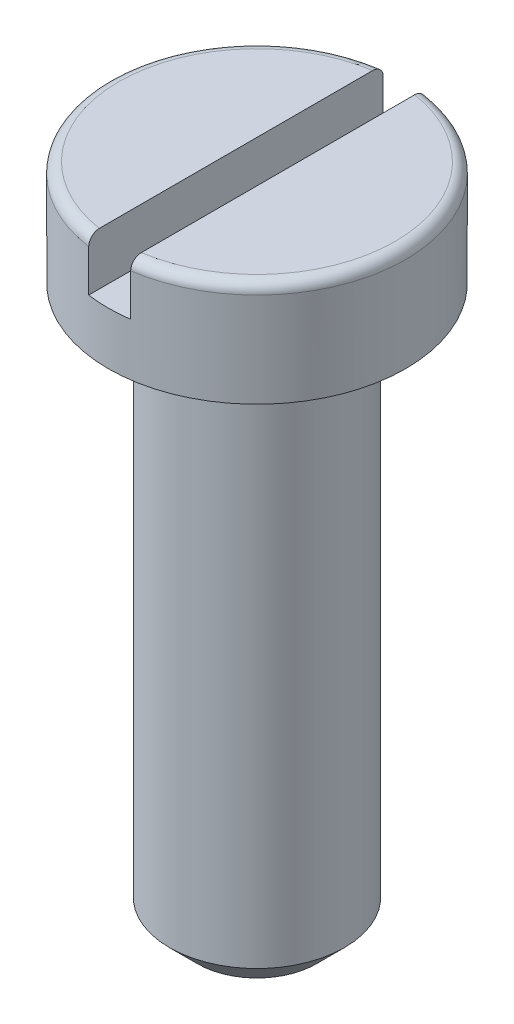
ISO-10303-21;
HEADER;
FILE_DESCRIPTION(('STEP AP214'),'2;1');
FILE_NAME('part.step','',(''),(''),'','','');
FILE_SCHEMA(('AUTOMOTIVE_DESIGN { 1 0 10303 214 1 1 1 1 }'));
ENDSEC;
DATA;
#1=APPLICATION_CONTEXT('core data for automotive mechanical design processes');
#2=APPLICATION_PROTOCOL_DEFINITION('international standard','automotive_design',2000,#1);
#3=PRODUCT_CONTEXT('',#1,'mechanical');
#4=PRODUCT('Part','Part','',(#3));
#5=PRODUCT_RELATED_PRODUCT_CATEGORY('part','',(#4));
#6=PRODUCT_DEFINITION_FORMATION('','',#4);
#7=PRODUCT_DEFINITION_CONTEXT('part definition',#1,'design');
#8=PRODUCT_DEFINITION('design','',#6,#7);
#9=PRODUCT_DEFINITION_SHAPE('','',#8);
#10=(LENGTH_UNIT() NAMED_UNIT(*) SI_UNIT(.MILLI.,.METRE.));
#11=(NAMED_UNIT(*) PLANE_ANGLE_UNIT() SI_UNIT($,.RADIAN.));
#12=(NAMED_UNIT(*) SI_UNIT($,.STERADIAN.) SOLID_ANGLE_UNIT());
#13=UNCERTAINTY_MEASURE_WITH_UNIT(LENGTH_MEASURE(1.E-05),#10,'distance_accuracy_value','');
#14=(GEOMETRIC_REPRESENTATION_CONTEXT(3) GLOBAL_UNCERTAINTY_ASSIGNED_CONTEXT((#13)) GLOBAL_UNIT_ASSIGNED_CONTEXT((#10,
#11,#12)) REPRESENTATION_CONTEXT('',''));
#15=CARTESIAN_POINT('',(0.,0.,0.));
#16=DIRECTION('',(0.,0.,1.));
#17=DIRECTION('',(1.,0.,0.));
#18=AXIS2_PLACEMENT_3D('',#15,#16,#17);
#19=CARTESIAN_POINT('',(0.,3.,0.));
#20=DIRECTION('',(0.,1.,0.));
#21=DIRECTION('',(-1.,0.,0.));
#22=AXIS2_PLACEMENT_3D('',#19,#20,#21);
#23=CYLINDRICAL_SURFACE('',#22,4.25000000000001);
#24=CARTESIAN_POINT('',(0.,0.,0.));
#25=DIRECTION('',(0.,1.,0.));
#26=DIRECTION('',(-1.,0.,0.));
#27=AXIS2_PLACEMENT_3D('',#24,#25,#26);
#28=CIRCLE('',#27,4.25000000000001);
#29=CARTESIAN_POINT('',(-4.25000000000001,0.,0.));
#30=VERTEX_POINT('',#29);
#31=EDGE_CURVE('E113',#30,#30,#28,.T.);
#32=ORIENTED_EDGE('',*,*,#31,.T.);
#33=EDGE_LOOP('',(#32));
#34=FACE_BOUND('',#33,.T.);
#35=DIRECTION('',(0.,1.,0.));
#36=VECTOR('',#35,1.);
#37=CARTESIAN_POINT('',(0.599999999999998,3.,4.20743389728229));
#38=LINE('',#37,#36);
#39=CARTESIAN_POINT('',(0.599999999999998,1.5,4.20743389728229));
#40=VERTEX_POINT('',#39);
#41=CARTESIAN_POINT('',(0.599999999999998,2.70000000000072,4.20743389728768));
#42=VERTEX_POINT('',#41);
#43=EDGE_CURVE('E164',#40,#42,#38,.T.);
#44=ORIENTED_EDGE('',*,*,#43,.F.);
#45=CARTESIAN_POINT('',(0.,1.5,0.));
#46=DIRECTION('',(0.,-1.,0.));
#47=DIRECTION('',(0.,0.,-1.));
#48=AXIS2_PLACEMENT_3D('',#45,#46,#47);
#49=CIRCLE('',#48,4.25000000000001);
#50=CARTESIAN_POINT('',(-0.600000000000002,1.5,4.20743389728229));
#51=VERTEX_POINT('',#50);
#52=EDGE_CURVE('E11',#40,#51,#49,.T.);
#53=ORIENTED_EDGE('',*,*,#52,.T.);
#54=DIRECTION('',(0.,1.,0.));
#55=VECTOR('',#54,1.);
#56=CARTESIAN_POINT('',(-0.600000000000002,3.,4.20743389728229));
#57=LINE('',#56,#55);
#58=CARTESIAN_POINT('',(-0.600000000000002,2.7,4.20743389728229));
#59=VERTEX_POINT('',#58);
#60=EDGE_CURVE('E100',#59,#51,#57,.F.);
#61=ORIENTED_EDGE('',*,*,#60,.F.);
#62=CARTESIAN_POINT('',(0.,2.7,0.));
#63=DIRECTION('',(0.,1.,0.));
#64=DIRECTION('',(-1.,0.,0.));
#65=AXIS2_PLACEMENT_3D('',#62,#63,#64);
#66=CIRCLE('',#65,4.25000000000001);
#67=CARTESIAN_POINT('',(-0.6,2.70000000000002,-4.20743389728246));
#68=VERTEX_POINT('',#67);
#69=EDGE_CURVE('E99',#68,#59,#66,.T.);
#70=ORIENTED_EDGE('',*,*,#69,.F.);
#71=DIRECTION('',(0.,1.,0.));
#72=VECTOR('',#71,1.);
#73=CARTESIAN_POINT('',(-0.600000000000001,3.,-4.20743389728229));
#74=LINE('',#73,#72);
#75=CARTESIAN_POINT('',(-0.6,1.5,-4.20743389728229));
#76=VERTEX_POINT('',#75);
#77=EDGE_CURVE('E129',#76,#68,#74,.T.);
#78=ORIENTED_EDGE('',*,*,#77,.F.);
#79=CARTESIAN_POINT('',(0.6,1.5,-4.20743389728229));
#80=VERTEX_POINT('',#79);
#81=EDGE_CURVE('E36',#76,#80,#49,.T.);
#82=ORIENTED_EDGE('',*,*,#81,.T.);
#83=DIRECTION('',(0.,1.,0.));
#84=VECTOR('',#83,1.);
#85=CARTESIAN_POINT('',(0.599999999999999,3.,-4.20743389728229));
#86=LINE('',#85,#84);
#87=CARTESIAN_POINT('',(0.6,2.7,-4.20743389728229));
#88=VERTEX_POINT('',#87);
#89=EDGE_CURVE('E105',#88,#80,#86,.F.);
#90=ORIENTED_EDGE('',*,*,#89,.F.);
#91=EDGE_CURVE('E112',#42,#88,#66,.T.);
#92=ORIENTED_EDGE('',*,*,#91,.F.);
#93=EDGE_LOOP('',(#44,#53,#61,#70,#78,#82,#90,#92));
#94=FACE_BOUND('',#93,.T.);
#95=ADVANCED_FACE('F32',(#34,#94),#23,.T.);
#96=CARTESIAN_POINT('',(0.,2.7,0.));
#97=DIRECTION('',(0.,1.,0.));
#98=DIRECTION('',(-1.,0.,0.));
#99=AXIS2_PLACEMENT_3D('',#96,#97,#98);
#100=TOROIDAL_SURFACE('',#99,3.95000000000001,0.299999999999999);
#101=CARTESIAN_POINT('',(0.599999999999999,2.87433157534757,-4.15100973770188));
#102=CARTESIAN_POINT('',(0.599999999999999,2.86074612791415,-4.16081020208984));
#103=CARTESIAN_POINT('',(0.599999999999999,2.84632842577599,-4.16947665276722));
#104=CARTESIAN_POINT('',(0.599999999999999,2.81623248509687,-4.18427603761293));
#105=CARTESIAN_POINT('',(0.599999999999999,2.8005528865773,-4.19040619346482));
#106=CARTESIAN_POINT('',(0.599999999999999,2.76838737827558,-4.19994022194313));
#107=CARTESIAN_POINT('',(0.6,2.75190164020678,-4.2033446725028));
#108=CARTESIAN_POINT('',(0.6,2.71859623939118,-4.20732503562328));
#109=CARTESIAN_POINT('',(0.6,2.7017766564124,-4.20790161589026));
#110=CARTESIAN_POINT('',(0.6,2.66834013987907,-4.20621401397528));
#111=CARTESIAN_POINT('',(0.6,2.65172270171053,-4.20395981368127));
#112=CARTESIAN_POINT('',(0.6,2.61910147103201,-4.1966950870985));
#113=CARTESIAN_POINT('',(0.6,2.60309769610794,-4.19168448188178));
#114=CARTESIAN_POINT('',(0.6,2.57214438516952,-4.17905176773285));
#115=CARTESIAN_POINT('',(0.6,2.55719556232011,-4.17142791221225));
#116=CARTESIAN_POINT('',(0.6,2.52877928057661,-4.15379388879993));
#117=CARTESIAN_POINT('',(0.6,2.51531185682216,-4.14378366431997));
#118=CARTESIAN_POINT('',(0.6,2.49014589142886,-4.12159612620691));
#119=CARTESIAN_POINT('',(0.6,2.47845917868156,-4.10940539900697));
#120=CARTESIAN_POINT('',(0.6,2.45727417970644,-4.08325172028507));
#121=CARTESIAN_POINT('',(0.6,2.44777599632627,-4.06928868552315));
#122=CARTESIAN_POINT('',(0.6,2.43113701258348,-4.03983965858947));
#123=CARTESIAN_POINT('',(0.6,2.42402044382204,-4.02433997597869));
#124=CARTESIAN_POINT('',(0.6,2.4124617776792,-3.99237362015859));
#125=CARTESIAN_POINT('',(0.599999999999999,2.40801983196477,-3.97590689217017));
#126=CARTESIAN_POINT('',(0.599999999999999,2.40189424019441,-3.9423011062131));
#127=CARTESIAN_POINT('',(0.599999999999999,2.40023804447947,-3.92515704180909));
#128=CARTESIAN_POINT('',(0.599999999999999,2.39980973703904,-3.89083267853541));
#129=CARTESIAN_POINT('',(0.599999999999999,2.40103774390554,-3.87365237820483));
#130=CARTESIAN_POINT('',(0.599999999999999,2.40635843074518,-3.83964172065979));
#131=CARTESIAN_POINT('',(0.599999999999999,2.41046716877027,-3.82281387225512));
#132=CARTESIAN_POINT('',(0.599999999999999,2.42145572146756,-3.79008808332832));
#133=CARTESIAN_POINT('',(0.599999999999999,2.42833555102213,-3.77419014780089));
#134=CARTESIAN_POINT('',(0.599999999999999,2.44466699096471,-3.74380813823681));
#135=CARTESIAN_POINT('',(0.599999999999999,2.45411435590554,-3.72932178338588));
#136=CARTESIAN_POINT('',(0.599999999999999,2.47532789660423,-3.70215936104873));
#137=CARTESIAN_POINT('',(0.599999999999999,2.48709397460834,-3.68948321728533));
#138=CARTESIAN_POINT('',(0.599999999999999,2.51249990849663,-3.66642897637423));
#139=CARTESIAN_POINT('',(0.599999999999999,2.52612170569853,-3.65603098409002));
#140=CARTESIAN_POINT('',(0.599999999999999,2.55493631193455,-3.63770466051979));
#141=CARTESIAN_POINT('',(0.599999999999999,2.57012900439448,-3.62977614615183));
#142=CARTESIAN_POINT('',(0.599999999999999,2.6014449791689,-3.61672075186139));
#143=CARTESIAN_POINT('',(0.599999999999999,2.61755382743564,-3.61155924441609));
#144=CARTESIAN_POINT('',(0.599999999999999,2.65041365604357,-3.60404499295968));
#145=CARTESIAN_POINT('',(0.599999999999999,2.66716459356352,-3.60169206197843));
#146=CARTESIAN_POINT('',(0.599999999999999,2.70065229013931,-3.59987798486624));
#147=CARTESIAN_POINT('',(0.599999999999999,2.71738748914671,-3.60038792013482));
#148=CARTESIAN_POINT('',(0.599999999999999,2.75053304877303,-3.60421637891453));
#149=CARTESIAN_POINT('',(0.599999999999999,2.766943416685,-3.60753483929585));
#150=CARTESIAN_POINT('',(0.599999999999999,2.79894346468028,-3.61686893936415));
#151=CARTESIAN_POINT('',(0.599999999999999,2.81453465002443,-3.62287942386281));
#152=CARTESIAN_POINT('',(0.599999999999999,2.84449688285196,-3.63741439907125));
#153=CARTESIAN_POINT('',(0.599999999999999,2.85886789651465,-3.64593895943684));
#154=CARTESIAN_POINT('',(0.599999999999999,2.88609674305118,-3.66532031967877));
#155=CARTESIAN_POINT('',(0.599999999999999,2.89894290704058,-3.67619350699539));
#156=CARTESIAN_POINT('',(0.599999999999999,2.9226553413124,-3.69991831961397));
#157=CARTESIAN_POINT('',(0.599999999999999,2.93352148484576,-3.71277007147469));
#158=CARTESIAN_POINT('',(0.599999999999999,2.95310882359935,-3.74025725984987));
#159=CARTESIAN_POINT('',(0.599999999999999,2.96180177164109,-3.75491282525037));
#160=CARTESIAN_POINT('',(0.599999999999999,2.97663599402454,-3.78546297626726));
#161=CARTESIAN_POINT('',(0.599999999999999,2.98277709824801,-3.80135764440436));
#162=CARTESIAN_POINT('',(0.599999999999999,2.99240126326856,-3.83412905713654));
#163=CARTESIAN_POINT('',(0.599999999999999,2.99585334256811,-3.85101490550278));
#164=CARTESIAN_POINT('',(0.599999999999999,2.99989003190482,-3.88512557488754));
#165=CARTESIAN_POINT('',(0.599999999999999,3.00047464135608,-3.90235039597533));
#166=CARTESIAN_POINT('',(0.599999999999999,2.99875422422309,-3.93674421714104));
#167=CARTESIAN_POINT('',(0.599999999999999,2.99643436597092,-3.95391247815952));
#168=CARTESIAN_POINT('',(0.599999999999999,2.98893717219372,-3.98761864326937));
#169=CARTESIAN_POINT('',(0.599999999999999,2.98375914118908,-4.00415639289083));
#170=CARTESIAN_POINT('',(0.599999999999999,2.97069763828969,-4.03608550570344));
#171=CARTESIAN_POINT('',(0.599999999999999,2.96281977484973,-4.05147916551919));
#172=CARTESIAN_POINT('',(0.599999999999999,2.94457488682459,-4.08069573888692));
#173=CARTESIAN_POINT('',(0.599999999999999,2.93421096206702,-4.09452057720044));
#174=CARTESIAN_POINT('',(0.599999999999999,2.9155037666203,-4.11548004449982));
#175=CARTESIAN_POINT('',(0.599999999999999,2.90781439751328,-4.12320818965504));
#176=CARTESIAN_POINT('',(0.599999999999999,2.89164446487417,-4.13778723793263));
#177=CARTESIAN_POINT('',(0.599999999999999,2.88316390516079,-4.14463814528865));
#178=CARTESIAN_POINT('',(0.599999999999999,2.87433157534757,-4.15100973770188));
#179=B_SPLINE_CURVE_WITH_KNOTS('',3,(#101,#102,#103,#104,#105,#106,#107,#108,#109,#110,#111,
#112,#113,#114,#115,#116,#117,#118,#119,#120,#121,#122,#123,#124,#125,#126,#127,#128,#129,#130,
#131,#132,#133,#134,#135,#136,#137,#138,#139,#140,#141,#142,#143,#144,#145,#146,#147,#148,#149,
#150,#151,#152,#153,#154,#155,#156,#157,#158,#159,#160,#161,#162,#163,#164,#165,#166,#167,#168,
#169,#170,#171,#172,#173,#174,#175,#176,#177,#178),.UNSPECIFIED.,.T.,.F.,(4,2,2,2,2,2,2,2,2,2,2,
2,2,2,2,2,2,2,2,2,2,2,2,2,2,2,2,2,2,2,2,2,2,2,2,2,2,2,4),(0.,0.0502151769076748,
0.100485215976974,0.150744593429114,0.200992103253378,0.251062926979241,0.301135184527051,
0.35124097376656,0.401347951288293,0.45177448843427,0.502203394839758,0.553130806279621,
0.604061105333617,0.655490385279995,0.706921779920744,0.758642171642028,0.810362841135697,
0.861998504871947,0.913631992185038,0.964794799879831,1.01595381356748,1.06645670014462,
1.11695622449975,1.16694656305627,1.216935777964,1.2668296708307,1.31672494620375,
1.36698030833096,1.41723888637612,1.4681202344947,1.51900497406622,1.57046764818199,
1.62193033281284,1.67365688683263,1.72539603303499,1.77702834474894,1.82859660862928,
1.86124324369966,1.89388972120811),.UNSPECIFIED.);
#180=CARTESIAN_POINT('',(0.599999999999999,3.,-3.904164443258));
#181=VERTEX_POINT('',#180);
#182=EDGE_CURVE('E55',#181,#88,#179,.T.);
#183=ORIENTED_EDGE('',*,*,#182,.F.);
#184=CARTESIAN_POINT('',(0.,3.,0.));
#185=DIRECTION('',(0.,1.,0.));
#186=DIRECTION('',(-1.,0.,0.));
#187=AXIS2_PLACEMENT_3D('',#184,#185,#186);
#188=CIRCLE('',#187,3.95000000000001);
#189=CARTESIAN_POINT('',(0.599999999999998,3.,3.904164443258));
#190=VERTEX_POINT('',#189);
#191=EDGE_CURVE('E104',#190,#181,#188,.T.);
#192=ORIENTED_EDGE('',*,*,#191,.F.);
#193=CARTESIAN_POINT('',(0.599999999999998,2.8287793434834,3.62979090887339));
#194=CARTESIAN_POINT('',(0.599999999999998,2.81376681038271,3.62255970666891));
#195=CARTESIAN_POINT('',(0.599999999999998,2.79813674153357,3.61658430212553));
#196=CARTESIAN_POINT('',(0.599999999999998,2.76608342830526,3.60733604799856));
#197=CARTESIAN_POINT('',(0.599999999999998,2.74965934981758,3.60406610880561));
#198=CARTESIAN_POINT('',(0.599999999999998,2.71649779236474,3.60033719034259));
#199=CARTESIAN_POINT('',(0.599999999999998,2.69976039620431,3.59987747860873));
#200=CARTESIAN_POINT('',(0.599999999999998,2.6664513452628,3.60178218897092));
#201=CARTESIAN_POINT('',(0.599999999999998,2.64987965386457,3.60414597257747));
#202=CARTESIAN_POINT('',(0.599999999999998,2.61740338053151,3.61161521138332));
#203=CARTESIAN_POINT('',(0.599999999999998,2.60149746918623,3.61671489145549));
#204=CARTESIAN_POINT('',(0.599999999999998,2.57075986419281,3.62949737162497));
#205=CARTESIAN_POINT('',(0.599999999999998,2.5559282282008,3.63718031024053));
#206=CARTESIAN_POINT('',(0.599999999999998,2.52766439068247,3.6549521692383));
#207=CARTESIAN_POINT('',(0.599999999999998,2.51424080648804,3.66505478833128));
#208=CARTESIAN_POINT('',(0.599999999999998,2.48925493869404,3.68734575504351));
#209=CARTESIAN_POINT('',(0.599999999999998,2.47769276130562,3.69953422159863));
#210=CARTESIAN_POINT('',(0.599999999999998,2.45660990205645,3.72580549327722));
#211=CARTESIAN_POINT('',(0.599999999999998,2.44711522472261,3.73990916583577));
#212=CARTESIAN_POINT('',(0.599999999999998,2.43059555360151,3.76949535045392));
#213=CARTESIAN_POINT('',(0.599999999999998,2.42357072042258,3.78497795210011));
#214=CARTESIAN_POINT('',(0.599999999999998,2.41210601816103,3.81708170715696));
#215=CARTESIAN_POINT('',(0.599999999999998,2.40769804591179,3.83371425624182));
#216=CARTESIAN_POINT('',(0.599999999999998,2.40171668849124,3.86748170481999));
#217=CARTESIAN_POINT('',(0.599999999999998,2.40014343251472,3.88461662717326));
#218=CARTESIAN_POINT('',(0.599999999999998,2.39987447316294,3.91902116085715));
#219=CARTESIAN_POINT('',(0.599999999999998,2.40119755642299,3.93629092322669));
#220=CARTESIAN_POINT('',(0.599999999999998,2.40672763130254,3.97036279436118));
#221=CARTESIAN_POINT('',(0.599999999999998,2.41093463465875,3.98716490122262));
#222=CARTESIAN_POINT('',(0.599999999999998,2.42211526180027,4.01979901719636));
#223=CARTESIAN_POINT('',(0.599999999999998,2.42908541118528,4.0356322158693));
#224=CARTESIAN_POINT('',(0.599999999999998,2.4456048652131,4.06589104166829));
#225=CARTESIAN_POINT('',(0.599999999999998,2.45515408049349,4.08031671754023));
#226=CARTESIAN_POINT('',(0.599999999999998,2.47648520402524,4.10722977330911));
#227=CARTESIAN_POINT('',(0.599999999999998,2.48824938565671,4.11973120021925));
#228=CARTESIAN_POINT('',(0.599999999999998,2.51372916655818,4.14255604675861));
#229=CARTESIAN_POINT('',(0.599999999999998,2.52744465590485,4.15287958899367));
#230=CARTESIAN_POINT('',(0.599999999999998,2.5562845897194,4.17094182195511));
#231=CARTESIAN_POINT('',(0.599999999999998,2.57139290104627,4.17870627370302));
#232=CARTESIAN_POINT('',(0.599999999999998,2.60270688005727,4.19156237334155));
#233=CARTESIAN_POINT('',(0.599999999999998,2.61891248880601,4.19665416465129));
#234=CARTESIAN_POINT('',(0.599999999999998,2.65180629479792,4.20397727489946));
#235=CARTESIAN_POINT('',(0.599999999999998,2.66848893351516,4.20623357626446));
#236=CARTESIAN_POINT('',(0.599999999999998,2.70199556586905,4.20790045828399));
#237=CARTESIAN_POINT('',(0.599999999999998,2.71881955502515,4.20731112880288));
#238=CARTESIAN_POINT('',(0.599999999999998,2.7520578917482,4.20331309580262));
#239=CARTESIAN_POINT('',(0.599999999999998,2.7684736479482,4.1999160858086));
#240=CARTESIAN_POINT('',(0.599999999999998,2.80050346020951,4.19041940696619));
#241=CARTESIAN_POINT('',(0.599999999999998,2.81611751560007,4.18431973585666));
#242=CARTESIAN_POINT('',(0.599999999999998,2.84613609186529,4.16958393679814));
#243=CARTESIAN_POINT('',(0.599999999999998,2.86053820694293,4.16094291002115));
#244=CARTESIAN_POINT('',(0.599999999999998,2.88770096800195,4.14138216601351));
#245=CARTESIAN_POINT('',(0.599999999999998,2.90046156456947,4.13046238021235));
#246=CARTESIAN_POINT('',(0.599999999999998,2.92408165355006,4.10657119790774));
#247=CARTESIAN_POINT('',(0.599999999999998,2.93492652833838,4.09358535259728));
#248=CARTESIAN_POINT('',(0.599999999999998,2.95430835093809,4.06599280972193));
#249=CARTESIAN_POINT('',(0.599999999999998,2.96284517531686,4.05138602552946));
#250=CARTESIAN_POINT('',(0.599999999999998,2.97746097999951,4.02080721650177));
#251=CARTESIAN_POINT('',(0.599999999999998,2.98351402456164,4.00482279500205));
#252=CARTESIAN_POINT('',(0.599999999999998,2.99287841657564,3.97207005468085));
#253=CARTESIAN_POINT('',(0.599999999999998,2.99618960947151,3.95530169172548));
#254=CARTESIAN_POINT('',(0.599999999999998,3.00000394031785,3.92129053261074));
#255=CARTESIAN_POINT('',(0.599999999999998,3.00048071759073,3.90404477682237));
#256=CARTESIAN_POINT('',(0.599999999999998,2.9985457955247,3.86971639116801));
#257=CARTESIAN_POINT('',(0.599999999999998,2.9961341033345,3.85263376089839));
#258=CARTESIAN_POINT('',(0.599999999999998,2.98847183054001,3.81904126674526));
#259=CARTESIAN_POINT('',(0.599999999999998,2.98320934165577,3.80253411680573));
#260=CARTESIAN_POINT('',(0.599999999999998,2.96997732334649,3.77063713544685));
#261=CARTESIAN_POINT('',(0.599999999999998,2.96200713712383,3.75524757621832));
#262=CARTESIAN_POINT('',(0.599999999999998,2.94360429648186,3.72608053747716));
#263=CARTESIAN_POINT('',(0.599999999999998,2.93317861173993,3.71229865732188));
#264=CARTESIAN_POINT('',(0.599999999999998,2.91014630591588,3.68671712372586));
#265=CARTESIAN_POINT('',(0.599999999999998,2.8975424431672,3.67491500002861));
#266=CARTESIAN_POINT('',(0.599999999999998,2.87548472091015,3.65755125865146));
#267=CARTESIAN_POINT('',(0.599999999999998,2.86657287921601,3.65128917707807));
#268=CARTESIAN_POINT('',(0.599999999999998,2.84812157049051,3.63976989134299));
#269=CARTESIAN_POINT('',(0.599999999999998,2.8385821070925,3.63451268136472));
#270=CARTESIAN_POINT('',(0.599999999999998,2.8287793434834,3.62979090887339));
#271=B_SPLINE_CURVE_WITH_KNOTS('',3,(#193,#194,#195,#196,#197,#198,#199,#200,#201,#202,#203,
#204,#205,#206,#207,#208,#209,#210,#211,#212,#213,#214,#215,#216,#217,#218,#219,#220,#221,#222,
#223,#224,#225,#226,#227,#228,#229,#230,#231,#232,#233,#234,#235,#236,#237,#238,#239,#240,#241,
#242,#243,#244,#245,#246,#247,#248,#249,#250,#251,#252,#253,#254,#255,#256,#257,#258,#259,#260,
#261,#262,#263,#264,#265,#266,#267,#268,#269,#270),.UNSPECIFIED.,.T.,.F.,(4,2,2,2,2,2,2,2,2,2,2,
2,2,2,2,2,2,2,2,2,2,2,2,2,2,2,2,2,2,2,2,2,2,2,2,2,2,2,4),(0.,0.0499506073729371,
0.0999548792494927,0.149946117348027,0.19992605284659,0.24980089983687,0.299678421619147,
0.349845286214804,0.400015012298885,0.450783347637207,0.501554983714455,0.552933402603393,
0.604314163051596,0.656029183417279,0.707744414249148,0.759394823180946,0.811043442699958,
0.862295046960618,0.913543765199363,0.964259601418476,1.01497271586858,1.06523581015038,
1.11549731714578,1.16555054190299,1.21560380853684,1.26575419959172,1.3159060999474,
1.36642553972278,1.41694768070163,1.46798471678125,1.51902462958237,1.57053849111416,
1.62205222515418,1.67378281930888,1.72552597056088,1.77712398754717,1.82865713592897,
1.86127367221478,1.89389001969748),.UNSPECIFIED.);
#272=EDGE_CURVE('E160',#42,#190,#271,.T.);
#273=ORIENTED_EDGE('',*,*,#272,.F.);
#274=ORIENTED_EDGE('',*,*,#91,.T.);
#275=EDGE_LOOP('',(#183,#192,#273,#274));
#276=FACE_BOUND('',#275,.T.);
#277=ADVANCED_FACE('F146',(#276),#100,.T.);
#278=CARTESIAN_POINT('',(-0.600000000000001,2.87433157534757,-4.15100973770188));
#279=CARTESIAN_POINT('',(-0.600000000000001,2.88810193262448,-4.14107399884885));
#280=CARTESIAN_POINT('',(-0.600000000000001,2.90103718949124,-4.12995834878117));
#281=CARTESIAN_POINT('',(-0.600000000000001,2.92486257409588,-4.10569813395944));
#282=CARTESIAN_POINT('',(-0.600000000000001,2.93574997506623,-4.09255090592594));
#283=CARTESIAN_POINT('',(-0.600000000000001,2.95515986645781,-4.06463043503621));
#284=CARTESIAN_POINT('',(-0.600000000000001,2.96368453074838,-4.04985870442596));
#285=CARTESIAN_POINT('',(-0.600000000000001,2.97815173733068,-4.01910661013517));
#286=CARTESIAN_POINT('',(-0.600000000000001,2.98409491654957,-4.0031265457293));
#287=CARTESIAN_POINT('',(-0.600000000000001,2.99328395632694,-3.97027707194967));
#288=CARTESIAN_POINT('',(-0.600000000000001,2.99650886965471,-3.953401802393));
#289=CARTESIAN_POINT('',(-0.600000000000001,3.00010224100974,-3.91934893509364));
#290=CARTESIAN_POINT('',(-0.600000000000001,3.00047044480969,-3.90217131057979));
#291=CARTESIAN_POINT('',(-0.600000000000001,2.99833518513633,-3.86787160189284));
#292=CARTESIAN_POINT('',(-0.600000000000001,2.99581115938109,-3.85075079415202));
#293=CARTESIAN_POINT('',(-0.600000000000001,2.98792669914403,-3.81717478394471));
#294=CARTESIAN_POINT('',(-0.600000000000001,2.98256622088591,-3.80071959175519));
#295=CARTESIAN_POINT('',(-0.600000000000001,2.96914931912596,-3.76893635344845));
#296=CARTESIAN_POINT('',(-0.600000000000001,2.96109143240389,-3.75360892460749));
#297=CARTESIAN_POINT('',(-0.600000000000001,2.94249896405966,-3.72453738975361));
#298=CARTESIAN_POINT('',(-0.600000000000001,2.93196445995923,-3.71079323420199));
#299=CARTESIAN_POINT('',(-0.600000000000001,2.90879434556879,-3.685390027285));
#300=CARTESIAN_POINT('',(-0.600000000000001,2.8961745321577,-3.67371657285841));
#301=CARTESIAN_POINT('',(-0.600000000000001,2.86913298246605,-3.65268602170601));
#302=CARTESIAN_POINT('',(-0.600000000000001,2.85471136776758,-3.64332876881425));
#303=CARTESIAN_POINT('',(-0.600000000000001,2.82466653009738,-3.62732050986538));
#304=CARTESIAN_POINT('',(-0.600000000000001,2.80906040012334,-3.62063742386336));
#305=CARTESIAN_POINT('',(-0.600000000000001,2.77693938800011,-3.61002094387139));
#306=CARTESIAN_POINT('',(-0.600000000000001,2.76042457266127,-3.6060873480181));
#307=CARTESIAN_POINT('',(-0.600000000000001,2.72715911499451,-3.60112242369101));
#308=CARTESIAN_POINT('',(-0.600000000000001,2.71041337347665,-3.60005821782975));
#309=CARTESIAN_POINT('',(-0.600000000000001,2.67698278445961,-3.60077041427518));
#310=CARTESIAN_POINT('',(-0.600000000000001,2.66029793473408,-3.60254671166191));
#311=CARTESIAN_POINT('',(-0.600000000000001,2.62754040952739,-3.60887009837193));
#312=CARTESIAN_POINT('',(-0.600000000000001,2.61146532023218,-3.61340470186669));
#313=CARTESIAN_POINT('',(-0.600000000000001,2.58029905357911,-3.62509547337324));
#314=CARTESIAN_POINT('',(-0.600000000000001,2.56520789132026,-3.63225168160416));
#315=CARTESIAN_POINT('',(-0.600000000000001,2.53635425801439,-3.64901284963227));
#316=CARTESIAN_POINT('',(-0.600000000000001,2.52259867368863,-3.65862965871191));
#317=CARTESIAN_POINT('',(-0.600000000000001,2.49687365289817,-3.68001160977598));
#318=CARTESIAN_POINT('',(-0.600000000000001,2.48490431615278,-3.69177687161877));
#319=CARTESIAN_POINT('',(-0.600000000000001,2.46294262012788,-3.71726569714722));
#320=CARTESIAN_POINT('',(-0.600000000000001,2.45297470013808,-3.7310103160355));
#321=CARTESIAN_POINT('',(-0.600000000000001,2.43545482795155,-3.75996144569079));
#322=CARTESIAN_POINT('',(-0.600000000000001,2.42790303815415,-3.77516805463563));
#323=CARTESIAN_POINT('',(-0.600000000000001,2.41533599391948,-3.80681189198716));
#324=CARTESIAN_POINT('',(-0.600000000000001,2.41035292612648,-3.82326190750061));
#325=CARTESIAN_POINT('',(-0.600000000000001,2.40319676576802,-3.85676239899909));
#326=CARTESIAN_POINT('',(-0.600000000000001,2.40102380951788,-3.87381290407198));
#327=CARTESIAN_POINT('',(-0.600000000000001,2.39954180443916,-3.90816244136604));
#328=CARTESIAN_POINT('',(-0.600000000000001,2.40025363980903,-3.92546237919475));
#329=CARTESIAN_POINT('',(-0.600000000000001,2.40457250634693,-3.95969741139006));
#330=CARTESIAN_POINT('',(-0.6,2.40817956022196,-3.97663250289413));
#331=CARTESIAN_POINT('',(-0.6,2.41819289509149,-4.00964628101469));
#332=CARTESIAN_POINT('',(-0.6,2.42459793043196,-4.02572534516274));
#333=CARTESIAN_POINT('',(-0.6,2.44003548560998,-4.05656891159808));
#334=CARTESIAN_POINT('',(-0.6,2.44906792837814,-4.07133345242751));
#335=CARTESIAN_POINT('',(-0.6,2.46943833096093,-4.09901288154388));
#336=CARTESIAN_POINT('',(-0.6,2.48075931494501,-4.11194025997894));
#337=CARTESIAN_POINT('',(-0.6,2.50543128787247,-4.13568631849787));
#338=CARTESIAN_POINT('',(-0.6,2.51878216873308,-4.14650511078441));
#339=CARTESIAN_POINT('',(-0.6,2.54698750027045,-4.16560819454503));
#340=CARTESIAN_POINT('',(-0.6,2.56182504864994,-4.17391744248525));
#341=CARTESIAN_POINT('',(-0.6,2.59269354234398,-4.18789983652039));
#342=CARTESIAN_POINT('',(-0.6,2.60872437403782,-4.19357323322129));
#343=CARTESIAN_POINT('',(-0.6,2.64136403334766,-4.20207194423999));
#344=CARTESIAN_POINT('',(-0.6,2.65796608382338,-4.20492330281751));
#345=CARTESIAN_POINT('',(-0.6,2.69141773308593,-4.20778403769969));
#346=CARTESIAN_POINT('',(-0.6,2.70826738539874,-4.20779279018193));
#347=CARTESIAN_POINT('',(-0.6,2.74165332840348,-4.2049736179751));
#348=CARTESIAN_POINT('',(-0.600000000000001,2.75819064743802,-4.20215776406143));
#349=CARTESIAN_POINT('',(-0.600000000000001,2.79054381151869,-4.19379293962427));
#350=CARTESIAN_POINT('',(-0.600000000000001,2.80636051813379,-4.18824733177503));
#351=CARTESIAN_POINT('',(-0.600000000000001,2.83087160318104,-4.17727026960444));
#352=CARTESIAN_POINT('',(-0.600000000000001,2.83993402119033,-4.17264096612863));
#353=CARTESIAN_POINT('',(-0.600000000000001,2.85754128848795,-4.16248536652616));
#354=CARTESIAN_POINT('',(-0.600000000000001,2.86608614007286,-4.15695907438006));
#355=CARTESIAN_POINT('',(-0.600000000000001,2.87433157534757,-4.15100973770188));
#356=B_SPLINE_CURVE_WITH_KNOTS('',3,(#278,#279,#280,#281,#282,#283,#284,#285,#286,#287,#288,
#289,#290,#291,#292,#293,#294,#295,#296,#297,#298,#299,#300,#301,#302,#303,#304,#305,#306,#307,
#308,#309,#310,#311,#312,#313,#314,#315,#316,#317,#318,#319,#320,#321,#322,#323,#324,#325,#326,
#327,#328,#329,#330,#331,#332,#333,#334,#335,#336,#337,#338,#339,#340,#341,#342,#343,#344,#345,
#346,#347,#348,#349,#350,#351,#352,#353,#354,#355),.UNSPECIFIED.,.T.,.F.,(4,2,2,2,2,2,2,2,2,2,2,
2,2,2,2,2,2,2,2,2,2,2,2,2,2,2,2,2,2,2,2,2,2,2,2,2,2,2,4),(0.,0.0509042796019208,
0.101875866904021,0.152800400209755,0.203712361810709,0.255013159600256,0.306318522752065,
0.357990916084571,0.409664106924688,0.461365373643397,0.513065022252414,0.564389615838271,
0.615710748007651,0.666396301755826,0.71707813385761,0.76717673680217,0.817273489292084,
0.867145142652717,0.917017561147013,0.967134820397832,1.01725487645619,1.06795400733152,
1.11865654521518,1.16997983233571,1.22130560899737,1.27300361548591,1.32470202744245,
1.37637744682039,1.42805135056346,1.47935515721021,1.53065623311904,1.581428932947,
1.63219680452574,1.68249165030027,1.73279753349262,1.78288934967858,1.83291961361199,
1.86340029009737,1.89388083132251),.UNSPECIFIED.);
#357=CARTESIAN_POINT('',(-0.600000000000001,3.,-3.904164443258));
#358=VERTEX_POINT('',#357);
#359=EDGE_CURVE('E47',#68,#358,#356,.T.);
#360=ORIENTED_EDGE('',*,*,#359,.F.);
#361=ORIENTED_EDGE('',*,*,#69,.T.);
#362=CARTESIAN_POINT('',(-0.600000000000002,2.8287793434834,3.62979090887339));
#363=CARTESIAN_POINT('',(-0.600000000000002,2.84402208144358,3.63713470441662));
#364=CARTESIAN_POINT('',(-0.600000000000002,2.85865044678587,3.64578414408794));
#365=CARTESIAN_POINT('',(-0.600000000000002,2.88625324576074,3.6654317538082));
#366=CARTESIAN_POINT('',(-0.600000000000002,2.89922543364558,3.6764330600373));
#367=CARTESIAN_POINT('',(-0.600000000000002,2.92313287578506,3.70044058799154));
#368=CARTESIAN_POINT('',(-0.600000000000002,2.9340702041753,3.71344474321331));
#369=CARTESIAN_POINT('',(-0.600000000000002,2.95362716304641,3.74108596245661));
#370=CARTESIAN_POINT('',(-0.600000000000002,2.96224735696797,3.7557226282854));
#371=CARTESIAN_POINT('',(-0.600000000000002,2.97701738769143,3.78636301914923));
#372=CARTESIAN_POINT('',(-0.600000000000002,2.98314331150594,3.80237827217641));
#373=CARTESIAN_POINT('',(-0.600000000000002,2.99264610944835,3.83520548565437));
#374=CARTESIAN_POINT('',(-0.600000000000002,2.99602272244264,3.85201752162433));
#375=CARTESIAN_POINT('',(-0.600000000000002,2.99995330564511,3.88611670214437));
#376=CARTESIAN_POINT('',(-0.600000000000002,3.00048254505885,3.9034067024408));
#377=CARTESIAN_POINT('',(-0.600000000000002,2.99863504664437,3.93783110508478));
#378=CARTESIAN_POINT('',(-0.600000000000002,2.99625826027335,3.95496550482833));
#379=CARTESIAN_POINT('',(-0.600000000000002,2.98865428622979,3.98861260777479));
#380=CARTESIAN_POINT('',(-0.600000000000002,2.98342358361157,4.00512451743962));
#381=CARTESIAN_POINT('',(-0.600000000000002,2.97024798611253,4.03702785790438));
#382=CARTESIAN_POINT('',(-0.600000000000002,2.96230316125103,4.0524193175974));
#383=CARTESIAN_POINT('',(-0.600000000000002,2.94397083896513,4.08154352907983));
#384=CARTESIAN_POINT('',(-0.600000000000002,2.93359819604261,4.09528562815517));
#385=CARTESIAN_POINT('',(-0.600000000000002,2.91067158278962,4.12081105659877));
#386=CARTESIAN_POINT('',(-0.600000000000002,2.89811772319786,4.13259448534784));
#387=CARTESIAN_POINT('',(-0.600000000000002,2.87131915054242,4.15374156732745));
#388=CARTESIAN_POINT('',(-0.600000000000002,2.85709261592503,4.16312825630592));
#389=CARTESIAN_POINT('',(-0.600000000000002,2.82725334649534,4.17935233665612));
#390=CARTESIAN_POINT('',(-0.600000000000002,2.81164069143467,4.18618987457789));
#391=CARTESIAN_POINT('',(-0.600000000000002,2.77963685480219,4.19705406705222));
#392=CARTESIAN_POINT('',(-0.600000000000002,2.76325477942877,4.20110755528721));
#393=CARTESIAN_POINT('',(-0.600000000000002,2.73004142790245,4.20638847557377));
#394=CARTESIAN_POINT('',(-0.600000000000002,2.71321016972758,4.20761602055937));
#395=CARTESIAN_POINT('',(-0.600000000000002,2.67968194914492,4.20720925300516));
#396=CARTESIAN_POINT('',(-0.600000000000002,2.66298477984297,4.20559176294641));
#397=CARTESIAN_POINT('',(-0.600000000000002,2.63009943979704,4.19957610840015));
#398=CARTESIAN_POINT('',(-0.600000000000002,2.61391126390026,4.19517797207207));
#399=CARTESIAN_POINT('',(-0.600000000000002,2.58250114368199,4.18373235860574));
#400=CARTESIAN_POINT('',(-0.600000000000002,2.56727918294762,4.1766849264846));
#401=CARTESIAN_POINT('',(-0.600000000000002,2.53822524517406,4.16014869494952));
#402=CARTESIAN_POINT('',(-0.600000000000002,2.52439329892653,4.15065984146971));
#403=CARTESIAN_POINT('',(-0.600000000000002,2.49842309174774,4.12945488707242));
#404=CARTESIAN_POINT('',(-0.600000000000002,2.48629513561534,4.11772616892288));
#405=CARTESIAN_POINT('',(-0.600000000000002,2.46415760463823,4.09241631641903));
#406=CARTESIAN_POINT('',(-0.600000000000002,2.45414812842962,4.07883509586089));
#407=CARTESIAN_POINT('',(-0.600000000000002,2.43642775989689,4.05006641366852));
#408=CARTESIAN_POINT('',(-0.600000000000002,2.42873997581102,4.03486471933221));
#409=CARTESIAN_POINT('',(-0.600000000000002,2.41599674330759,4.0033954998661));
#410=CARTESIAN_POINT('',(-0.600000000000002,2.41094144326738,3.98712791471661));
#411=CARTESIAN_POINT('',(-0.600000000000002,2.4035562781359,3.95381416182811));
#412=CARTESIAN_POINT('',(-0.600000000000002,2.40125421501809,3.93676182827581));
#413=CARTESIAN_POINT('',(-0.600000000000002,2.39952593450987,3.90251184859643));
#414=CARTESIAN_POINT('',(-0.600000000000002,2.40009984119371,3.88531419623201));
#415=CARTESIAN_POINT('',(-0.600000000000002,2.40411883475226,3.85114761464802));
#416=CARTESIAN_POINT('',(-0.600000000000002,2.40758193379372,3.83418080064611));
#417=CARTESIAN_POINT('',(-0.600000000000002,2.41730914046396,3.80106947269988));
#418=CARTESIAN_POINT('',(-0.600000000000002,2.42357328238309,3.78492496882497));
#419=CARTESIAN_POINT('',(-0.600000000000002,2.43872811658275,3.7539338805938));
#420=CARTESIAN_POINT('',(-0.600000000000002,2.44761685226683,3.7390863400171));
#421=CARTESIAN_POINT('',(-0.600000000000002,2.46778066345396,3.71111051781223));
#422=CARTESIAN_POINT('',(-0.600000000000002,2.47905565496768,3.69798217569954));
#423=CARTESIAN_POINT('',(-0.600000000000002,2.50357532197138,3.67393963236692));
#424=CARTESIAN_POINT('',(-0.600000000000002,2.51680273006946,3.66300782660762));
#425=CARTESIAN_POINT('',(-0.600000000000002,2.54492446612148,3.64355458577378));
#426=CARTESIAN_POINT('',(-0.600000000000002,2.55981860687493,3.63503288038524));
#427=CARTESIAN_POINT('',(-0.600000000000002,2.59064678877619,3.62075671952956));
#428=CARTESIAN_POINT('',(-0.600000000000002,2.60656506184595,3.614968208799));
#429=CARTESIAN_POINT('',(-0.600000000000002,2.63915786230959,3.60617729739038));
#430=CARTESIAN_POINT('',(-0.600000000000002,2.65583252978184,3.60317541500179));
#431=CARTESIAN_POINT('',(-0.600000000000002,2.68927516151976,3.60006991065224));
#432=CARTESIAN_POINT('',(-0.600000000000002,2.70604042281451,3.59993693084597));
#433=CARTESIAN_POINT('',(-0.600000000000002,2.73933870196245,3.60249968880247));
#434=CARTESIAN_POINT('',(-0.600000000000002,2.7558719865562,3.60519185171596));
#435=CARTESIAN_POINT('',(-0.600000000000002,2.78182332518003,3.61169917002469));
#436=CARTESIAN_POINT('',(-0.600000000000002,2.79146719350153,3.61464791807873));
#437=CARTESIAN_POINT('',(-0.600000000000002,2.8104064505879,3.62150706793299));
#438=CARTESIAN_POINT('',(-0.600000000000002,2.81970184233911,3.62541746149004));
#439=CARTESIAN_POINT('',(-0.600000000000002,2.8287793434834,3.62979090887339));
#440=B_SPLINE_CURVE_WITH_KNOTS('',3,(#362,#363,#364,#365,#366,#367,#368,#369,#370,#371,#372,
#373,#374,#375,#376,#377,#378,#379,#380,#381,#382,#383,#384,#385,#386,#387,#388,#389,#390,#391,
#392,#393,#394,#395,#396,#397,#398,#399,#400,#401,#402,#403,#404,#405,#406,#407,#408,#409,#410,
#411,#412,#413,#414,#415,#416,#417,#418,#419,#420,#421,#422,#423,#424,#425,#426,#427,#428,#429,
#430,#431,#432,#433,#434,#435,#436,#437,#438,#439),.UNSPECIFIED.,.T.,.F.,(4,2,2,2,2,2,2,2,2,2,2,
2,2,2,2,2,2,2,2,2,2,2,2,2,2,2,2,2,2,2,2,2,2,2,2,2,2,2,4),(0.,0.0507213841108845,
0.101510831113598,0.152248221269248,0.202973262800397,0.254173769786599,0.305379139305545,
0.357028542289417,0.408678808046479,0.460392831471372,0.512105520871385,0.563509718126947,
0.614911306392893,0.6657984943119,0.716682756288228,0.767069422591455,0.817454075242106,
0.867541807875725,0.91762903328186,0.967715407639175,1.01780289126707,1.0681813176646,
1.11856208915791,1.16942892988245,1.22029863735551,1.27167779945487,1.3230591781583,
1.37476329989926,1.42646805461904,1.47813436109676,1.52979884937182,1.58103111541993,
1.6322576330371,1.68282783504915,1.73340744081103,1.78346921074543,1.83346771034224,
1.86367405320075,1.89388013714113),.UNSPECIFIED.);
#441=CARTESIAN_POINT('',(-0.600000000000002,3.,3.904164443258));
#442=VERTEX_POINT('',#441);
#443=EDGE_CURVE('E86',#442,#59,#440,.T.);
#444=ORIENTED_EDGE('',*,*,#443,.F.);
#445=EDGE_CURVE('E97',#358,#442,#188,.T.);
#446=ORIENTED_EDGE('',*,*,#445,.F.);
#447=EDGE_LOOP('',(#360,#361,#444,#446));
#448=FACE_BOUND('',#447,.T.);
#449=ADVANCED_FACE('F96',(#448),#100,.T.);
#450=CARTESIAN_POINT('',(0.,3.,0.));
#451=DIRECTION('',(0.,-1.,0.));
#452=DIRECTION('',(1.,0.,0.));
#453=AXIS2_PLACEMENT_3D('',#450,#451,#452);
#454=PLANE('',#453);
#455=DIRECTION('',(0.,0.,-1.));
#456=VECTOR('',#455,1.);
#457=CARTESIAN_POINT('',(0.599999999999999,3.,0.));
#458=LINE('',#457,#456);
#459=EDGE_CURVE('E91',#190,#181,#458,.T.);
#460=ORIENTED_EDGE('',*,*,#459,.F.);
#461=ORIENTED_EDGE('',*,*,#191,.T.);
#462=EDGE_LOOP('',(#460,#461));
#463=FACE_BOUND('',#462,.T.);
#464=ADVANCED_FACE('F171',(#463),#454,.F.);
#465=DIRECTION('',(0.,0.,1.));
#466=VECTOR('',#465,1.);
#467=CARTESIAN_POINT('',(-0.600000000000001,3.,0.));
#468=LINE('',#467,#466);
#469=EDGE_CURVE('E83',#358,#442,#468,.T.);
#470=ORIENTED_EDGE('',*,*,#469,.F.);
#471=ORIENTED_EDGE('',*,*,#445,.T.);
#472=EDGE_LOOP('',(#470,#471));
#473=FACE_BOUND('',#472,.T.);
#474=ADVANCED_FACE('F103',(#473),#454,.F.);
#475=CARTESIAN_POINT('',(0.,-16.,0.));
#476=DIRECTION('',(0.,1.,0.));
#477=DIRECTION('',(0.,0.,1.));
#478=AXIS2_PLACEMENT_3D('',#475,#476,#477);
#479=CYLINDRICAL_SURFACE('',#478,2.5);
#480=CARTESIAN_POINT('',(0.,-15.2,0.));
#481=DIRECTION('',(0.,1.,0.));
#482=DIRECTION('',(0.,0.,1.));
#483=AXIS2_PLACEMENT_3D('',#480,#481,#482);
#484=CIRCLE('',#483,2.5);
#485=CARTESIAN_POINT('',(0.,-15.2,2.5));
#486=VERTEX_POINT('',#485);
#487=EDGE_CURVE('E119',#486,#486,#484,.T.);
#488=ORIENTED_EDGE('',*,*,#487,.T.);
#489=EDGE_LOOP('',(#488));
#490=FACE_BOUND('',#489,.T.);
#491=CARTESIAN_POINT('',(0.,0.,0.));
#492=DIRECTION('',(0.,1.,0.));
#493=DIRECTION('',(0.,0.,1.));
#494=AXIS2_PLACEMENT_3D('',#491,#492,#493);
#495=CIRCLE('',#494,2.5);
#496=CARTESIAN_POINT('',(0.,0.,2.5));
#497=VERTEX_POINT('',#496);
#498=EDGE_CURVE('E116',#497,#497,#495,.T.);
#499=ORIENTED_EDGE('',*,*,#498,.F.);
#500=EDGE_LOOP('',(#499));
#501=FACE_BOUND('',#500,.T.);
#502=ADVANCED_FACE('F177',(#490,#501),#479,.T.);
#503=CARTESIAN_POINT('',(0.,-16.,0.));
#504=DIRECTION('',(0.,1.,0.));
#505=DIRECTION('',(0.,0.,1.));
#506=AXIS2_PLACEMENT_3D('',#503,#504,#505);
#507=PLANE('',#506);
#508=CARTESIAN_POINT('',(0.,-16.,0.));
#509=DIRECTION('',(0.,1.,0.));
#510=DIRECTION('',(0.,0.,1.));
#511=AXIS2_PLACEMENT_3D('',#508,#509,#510);
#512=CIRCLE('',#511,1.7);
#513=CARTESIAN_POINT('',(0.,-16.,1.7));
#514=VERTEX_POINT('',#513);
#515=EDGE_CURVE('E92',#514,#514,#512,.F.);
#516=ORIENTED_EDGE('',*,*,#515,.T.);
#517=EDGE_LOOP('',(#516));
#518=FACE_BOUND('',#517,.T.);
#519=ADVANCED_FACE('F188',(#518),#507,.F.);
#520=CARTESIAN_POINT('',(0.,-15.2,0.));
#521=DIRECTION('',(0.,1.,0.));
#522=DIRECTION('',(0.,0.,1.));
#523=AXIS2_PLACEMENT_3D('',#520,#521,#522);
#524=CONICAL_SURFACE('',#523,2.5,0.78539816339745);
#525=ORIENTED_EDGE('',*,*,#515,.F.);
#526=EDGE_LOOP('',(#525));
#527=FACE_BOUND('',#526,.T.);
#528=ORIENTED_EDGE('',*,*,#487,.F.);
#529=EDGE_LOOP('',(#528));
#530=FACE_BOUND('',#529,.T.);
#531=ADVANCED_FACE('F34',(#527,#530),#524,.T.);
#532=CARTESIAN_POINT('',(0.,0.,0.));
#533=DIRECTION('',(0.,1.,0.));
#534=DIRECTION('',(-1.,0.,0.));
#535=AXIS2_PLACEMENT_3D('',#532,#533,#534);
#536=PLANE('',#535);
#537=ORIENTED_EDGE('',*,*,#498,.T.);
#538=EDGE_LOOP('',(#537));
#539=FACE_BOUND('',#538,.T.);
#540=ORIENTED_EDGE('',*,*,#31,.F.);
#541=EDGE_LOOP('',(#540));
#542=FACE_BOUND('',#541,.T.);
#543=ADVANCED_FACE('F184',(#539,#542),#536,.F.);
#544=CARTESIAN_POINT('',(0.599999999999998,1.5,4.25000000000001));
#545=DIRECTION('',(0.,-1.,0.));
#546=DIRECTION('',(0.,0.,-1.));
#547=AXIS2_PLACEMENT_3D('',#544,#545,#546);
#548=PLANE('',#547);
#549=DIRECTION('',(0.,0.,1.));
#550=VECTOR('',#549,1.);
#551=CARTESIAN_POINT('',(0.6,1.5,-4.25000000000001));
#552=LINE('',#551,#550);
#553=EDGE_CURVE('E136',#80,#40,#552,.T.);
#554=ORIENTED_EDGE('',*,*,#553,.F.);
#555=ORIENTED_EDGE('',*,*,#81,.F.);
#556=DIRECTION('',(0.,0.,-1.));
#557=VECTOR('',#556,1.);
#558=CARTESIAN_POINT('',(-0.6,1.5,-4.25000000000001));
#559=LINE('',#558,#557);
#560=EDGE_CURVE('E101',#51,#76,#559,.T.);
#561=ORIENTED_EDGE('',*,*,#560,.F.);
#562=ORIENTED_EDGE('',*,*,#52,.F.);
#563=EDGE_LOOP('',(#554,#555,#561,#562));
#564=FACE_BOUND('',#563,.T.);
#565=ADVANCED_FACE('F137',(#564),#548,.F.);
#566=CARTESIAN_POINT('',(0.6,1.5,-4.25000000000001));
#567=DIRECTION('',(-1.,0.,0.));
#568=DIRECTION('',(0.,0.,1.));
#569=AXIS2_PLACEMENT_3D('',#566,#567,#568);
#570=PLANE('',#569);
#571=ORIENTED_EDGE('',*,*,#89,.T.);
#572=ORIENTED_EDGE('',*,*,#553,.T.);
#573=ORIENTED_EDGE('',*,*,#43,.T.);
#574=ORIENTED_EDGE('',*,*,#272,.T.);
#575=ORIENTED_EDGE('',*,*,#459,.T.);
#576=ORIENTED_EDGE('',*,*,#182,.T.);
#577=EDGE_LOOP('',(#571,#572,#573,#574,#575,#576));
#578=FACE_BOUND('',#577,.T.);
#579=ADVANCED_FACE('F135',(#578),#570,.T.);
#580=CARTESIAN_POINT('',(-0.6,1.5,-4.25000000000001));
#581=DIRECTION('',(1.,0.,0.));
#582=DIRECTION('',(0.,0.,-1.));
#583=AXIS2_PLACEMENT_3D('',#580,#581,#582);
#584=PLANE('',#583);
#585=ORIENTED_EDGE('',*,*,#77,.T.);
#586=ORIENTED_EDGE('',*,*,#359,.T.);
#587=ORIENTED_EDGE('',*,*,#469,.T.);
#588=ORIENTED_EDGE('',*,*,#443,.T.);
#589=ORIENTED_EDGE('',*,*,#60,.T.);
#590=ORIENTED_EDGE('',*,*,#560,.T.);
#591=EDGE_LOOP('',(#585,#586,#587,#588,#589,#590));
#592=FACE_BOUND('',#591,.T.);
#593=ADVANCED_FACE('F85',(#592),#584,.T.);
#594=CLOSED_SHELL('',(#95,#277,#449,#464,#474,#502,#519,#531,#543,#565,#579,#593));
#595=MANIFOLD_SOLID_BREP('B2',#594);
#596=ADVANCED_BREP_SHAPE_REPRESENTATION('',(#18,#595),#14);
#597=SHAPE_DEFINITION_REPRESENTATION(#9,#596);
ENDSEC;
END-ISO-10303-21;
